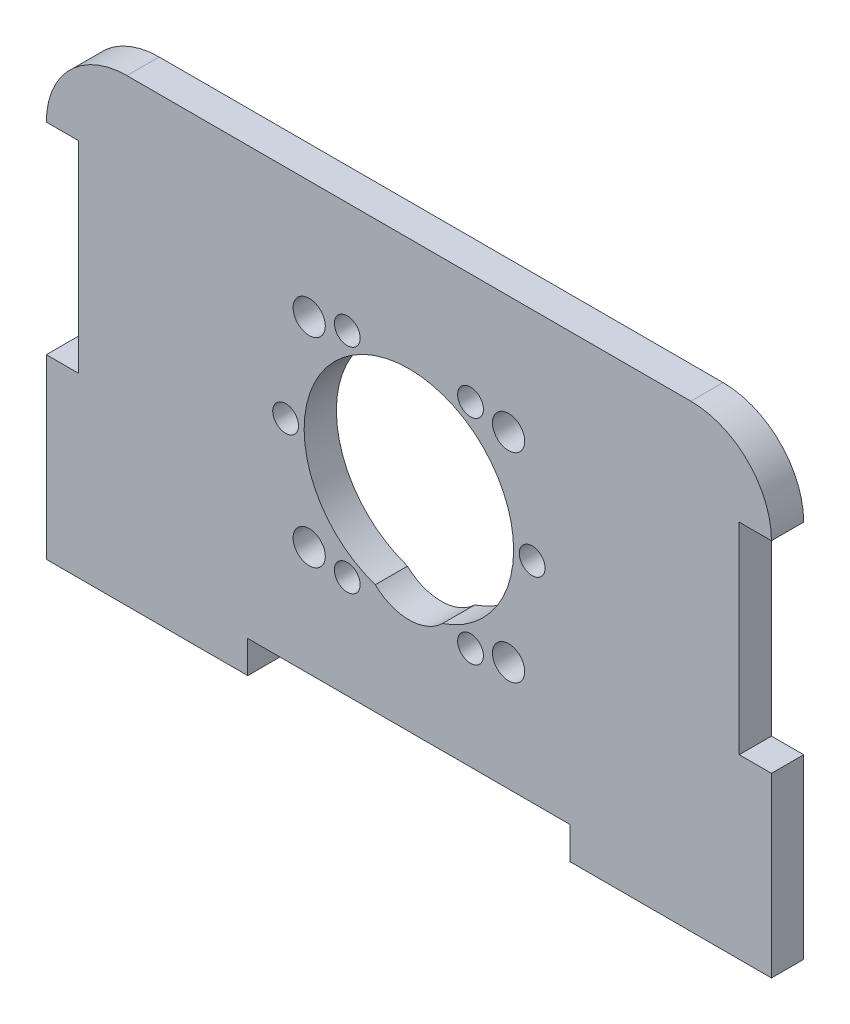
ISO-10303-21;
HEADER;
FILE_DESCRIPTION(('STEP AP214'),'2;1');
FILE_NAME('part.step','',(''),(''),'','','');
FILE_SCHEMA(('AUTOMOTIVE_DESIGN { 1 0 10303 214 1 1 1 1 }'));
ENDSEC;
DATA;
#1=APPLICATION_CONTEXT('core data for automotive mechanical design processes');
#2=APPLICATION_PROTOCOL_DEFINITION('international standard','automotive_design',2000,#1);
#3=PRODUCT_CONTEXT('',#1,'mechanical');
#4=PRODUCT('Part','Part','',(#3));
#5=PRODUCT_RELATED_PRODUCT_CATEGORY('part','',(#4));
#6=PRODUCT_DEFINITION_FORMATION('','',#4);
#7=PRODUCT_DEFINITION_CONTEXT('part definition',#1,'design');
#8=PRODUCT_DEFINITION('design','',#6,#7);
#9=PRODUCT_DEFINITION_SHAPE('','',#8);
#10=(LENGTH_UNIT() NAMED_UNIT(*) SI_UNIT(.MILLI.,.METRE.));
#11=(NAMED_UNIT(*) PLANE_ANGLE_UNIT() SI_UNIT($,.RADIAN.));
#12=(NAMED_UNIT(*) SI_UNIT($,.STERADIAN.) SOLID_ANGLE_UNIT());
#13=UNCERTAINTY_MEASURE_WITH_UNIT(LENGTH_MEASURE(1.E-05),#10,'distance_accuracy_value','');
#14=(GEOMETRIC_REPRESENTATION_CONTEXT(3) GLOBAL_UNCERTAINTY_ASSIGNED_CONTEXT((#13)) GLOBAL_UNIT_ASSIGNED_CONTEXT((#10,
#11,#12)) REPRESENTATION_CONTEXT('',''));
#15=CARTESIAN_POINT('',(0.,0.,0.));
#16=DIRECTION('',(0.,0.,1.));
#17=DIRECTION('',(1.,0.,0.));
#18=AXIS2_PLACEMENT_3D('',#15,#16,#17);
#19=CARTESIAN_POINT('',(25.,50.,2.));
#20=DIRECTION('',(0.,0.,-1.));
#21=DIRECTION('',(-1.,0.,0.));
#22=AXIS2_PLACEMENT_3D('',#19,#20,#21);
#23=PLANE('',#22);
#24=CARTESIAN_POINT('',(-7.65000000000015,36.2501886779018,2.));
#25=DIRECTION('',(0.,0.,1.));
#26=DIRECTION('',(0.50000000000001,-0.866025403784433,0.));
#27=AXIS2_PLACEMENT_3D('',#24,#25,#26);
#28=CIRCLE('',#27,1.6);
#29=CARTESIAN_POINT('',(-6.85000000000014,34.8645480318467,2.));
#30=VERTEX_POINT('',#29);
#31=EDGE_CURVE('E251',#30,#30,#28,.T.);
#32=ORIENTED_EDGE('',*,*,#31,.F.);
#33=EDGE_LOOP('',(#32));
#34=FACE_BOUND('',#33,.T.);
#35=CARTESIAN_POINT('',(7.64999999999988,36.250188677902,2.));
#36=DIRECTION('',(0.,0.,1.));
#37=DIRECTION('',(-0.499999999999992,-0.866025403784443,0.));
#38=AXIS2_PLACEMENT_3D('',#35,#36,#37);
#39=CIRCLE('',#38,1.6);
#40=CARTESIAN_POINT('',(6.84999999999989,34.8645480318469,2.));
#41=VERTEX_POINT('',#40);
#42=EDGE_CURVE('E258',#41,#41,#39,.T.);
#43=ORIENTED_EDGE('',*,*,#42,.F.);
#44=EDGE_LOOP('',(#43));
#45=FACE_BOUND('',#44,.T.);
#46=CARTESIAN_POINT('',(15.3,23.,2.));
#47=DIRECTION('',(0.,0.,1.));
#48=DIRECTION('',(-1.,0.,0.));
#49=AXIS2_PLACEMENT_3D('',#46,#47,#48);
#50=CIRCLE('',#49,1.6);
#51=CARTESIAN_POINT('',(13.7,23.,2.));
#52=VERTEX_POINT('',#51);
#53=EDGE_CURVE('E255',#52,#52,#50,.T.);
#54=ORIENTED_EDGE('',*,*,#53,.F.);
#55=EDGE_LOOP('',(#54));
#56=FACE_BOUND('',#55,.T.);
#57=CARTESIAN_POINT('',(7.65000000000006,9.74981132209812,2.));
#58=DIRECTION('',(0.,0.,1.));
#59=DIRECTION('',(-0.500000000000004,0.866025403784436,0.));
#60=AXIS2_PLACEMENT_3D('',#57,#58,#59);
#61=CIRCLE('',#60,1.6);
#62=CARTESIAN_POINT('',(6.85000000000006,11.1354519681532,2.));
#63=VERTEX_POINT('',#62);
#64=EDGE_CURVE('E252',#63,#63,#61,.T.);
#65=ORIENTED_EDGE('',*,*,#64,.F.);
#66=EDGE_LOOP('',(#65));
#67=FACE_BOUND('',#66,.T.);
#68=CARTESIAN_POINT('',(-7.64999999999997,9.74981132209807,2.));
#69=DIRECTION('',(0.,0.,1.));
#70=DIRECTION('',(0.499999999999998,0.86602540378444,0.));
#71=AXIS2_PLACEMENT_3D('',#68,#69,#70);
#72=CIRCLE('',#71,1.6);
#73=CARTESIAN_POINT('',(-6.84999999999997,11.1354519681532,2.));
#74=VERTEX_POINT('',#73);
#75=EDGE_CURVE('E197',#74,#74,#72,.T.);
#76=ORIENTED_EDGE('',*,*,#75,.F.);
#77=EDGE_LOOP('',(#76));
#78=FACE_BOUND('',#77,.T.);
#79=CARTESIAN_POINT('',(-15.3,23.,2.));
#80=DIRECTION('',(0.,0.,1.));
#81=DIRECTION('',(1.,0.,0.));
#82=AXIS2_PLACEMENT_3D('',#79,#80,#81);
#83=CIRCLE('',#82,1.6);
#84=CARTESIAN_POINT('',(-13.7,23.,2.));
#85=VERTEX_POINT('',#84);
#86=EDGE_CURVE('E192',#85,#85,#83,.T.);
#87=ORIENTED_EDGE('',*,*,#86,.F.);
#88=EDGE_LOOP('',(#87));
#89=FACE_BOUND('',#88,.T.);
#90=CARTESIAN_POINT('',(-12.3743686707645,10.6256313292353,2.));
#91=DIRECTION('',(0.,0.,1.));
#92=DIRECTION('',(1.,0.,0.));
#93=AXIS2_PLACEMENT_3D('',#90,#91,#92);
#94=CIRCLE('',#93,2.);
#95=CARTESIAN_POINT('',(-10.3743686707645,10.6256313292353,2.));
#96=VERTEX_POINT('',#95);
#97=EDGE_CURVE('E319',#96,#96,#94,.T.);
#98=ORIENTED_EDGE('',*,*,#97,.F.);
#99=EDGE_LOOP('',(#98));
#100=FACE_BOUND('',#99,.T.);
#101=CARTESIAN_POINT('',(12.3743686707646,10.6256313292354,2.));
#102=DIRECTION('',(0.,0.,1.));
#103=DIRECTION('',(1.,0.,0.));
#104=AXIS2_PLACEMENT_3D('',#101,#102,#103);
#105=CIRCLE('',#104,2.);
#106=CARTESIAN_POINT('',(14.3743686707646,10.6256313292354,2.));
#107=VERTEX_POINT('',#106);
#108=EDGE_CURVE('E324',#107,#107,#105,.T.);
#109=ORIENTED_EDGE('',*,*,#108,.F.);
#110=EDGE_LOOP('',(#109));
#111=FACE_BOUND('',#110,.T.);
#112=CARTESIAN_POINT('',(12.3743686707646,35.3743686707646,2.));
#113=DIRECTION('',(0.,0.,1.));
#114=DIRECTION('',(1.,0.,0.));
#115=AXIS2_PLACEMENT_3D('',#112,#113,#114);
#116=CIRCLE('',#115,2.);
#117=CARTESIAN_POINT('',(14.3743686707646,35.3743686707646,2.));
#118=VERTEX_POINT('',#117);
#119=EDGE_CURVE('E320',#118,#118,#116,.T.);
#120=ORIENTED_EDGE('',*,*,#119,.F.);
#121=EDGE_LOOP('',(#120));
#122=FACE_BOUND('',#121,.T.);
#123=CARTESIAN_POINT('',(-12.3743686707646,35.3743686707646,2.));
#124=DIRECTION('',(0.,0.,1.));
#125=DIRECTION('',(1.,0.,0.));
#126=AXIS2_PLACEMENT_3D('',#123,#124,#125);
#127=CIRCLE('',#126,2.);
#128=CARTESIAN_POINT('',(-10.3743686707646,35.3743686707646,2.));
#129=VERTEX_POINT('',#128);
#130=EDGE_CURVE('E323',#129,#129,#127,.T.);
#131=ORIENTED_EDGE('',*,*,#130,.F.);
#132=EDGE_LOOP('',(#131));
#133=FACE_BOUND('',#132,.T.);
#134=CARTESIAN_POINT('',(0.,23.,2.));
#135=DIRECTION('',(0.,0.,1.));
#136=DIRECTION('',(1.,0.,0.));
#137=AXIS2_PLACEMENT_3D('',#134,#135,#136);
#138=CIRCLE('',#137,13.);
#139=CARTESIAN_POINT('',(4.17161164899131,10.6875,2.));
#140=VERTEX_POINT('',#139);
#141=CARTESIAN_POINT('',(-4.17161164899131,10.6875,2.));
#142=VERTEX_POINT('',#141);
#143=EDGE_CURVE('E332',#140,#142,#138,.T.);
#144=ORIENTED_EDGE('',*,*,#143,.F.);
#145=CARTESIAN_POINT('',(0.,15.,2.));
#146=DIRECTION('',(0.,0.,1.));
#147=DIRECTION('',(1.,0.,0.));
#148=AXIS2_PLACEMENT_3D('',#145,#146,#147);
#149=CIRCLE('',#148,6.);
#150=EDGE_CURVE('E248',#142,#140,#149,.T.);
#151=ORIENTED_EDGE('',*,*,#150,.F.);
#152=EDGE_LOOP('',(#144,#151));
#153=FACE_BOUND('',#152,.T.);
#154=DIRECTION('',(0.,1.,0.));
#155=VECTOR('',#154,1.);
#156=CARTESIAN_POINT('',(45.,50.,2.));
#157=LINE('',#156,#155);
#158=CARTESIAN_POINT('',(45.,-7.,2.));
#159=VERTEX_POINT('',#158);
#160=CARTESIAN_POINT('',(45.,15.,2.));
#161=VERTEX_POINT('',#160);
#162=EDGE_CURVE('E310',#159,#161,#157,.T.);
#163=ORIENTED_EDGE('',*,*,#162,.T.);
#164=DIRECTION('',(1.,0.,0.));
#165=VECTOR('',#164,1.);
#166=CARTESIAN_POINT('',(45.,15.,2.));
#167=LINE('',#166,#165);
#168=CARTESIAN_POINT('',(41.,15.,2.));
#169=VERTEX_POINT('',#168);
#170=EDGE_CURVE('E376',#169,#161,#167,.T.);
#171=ORIENTED_EDGE('',*,*,#170,.F.);
#172=DIRECTION('',(0.,-1.,0.));
#173=VECTOR('',#172,1.);
#174=CARTESIAN_POINT('',(41.,40.,2.));
#175=LINE('',#174,#173);
#176=CARTESIAN_POINT('',(41.,40.,2.));
#177=VERTEX_POINT('',#176);
#178=EDGE_CURVE('E175',#177,#169,#175,.T.);
#179=ORIENTED_EDGE('',*,*,#178,.F.);
#180=DIRECTION('',(-1.,0.,0.));
#181=VECTOR('',#180,1.);
#182=CARTESIAN_POINT('',(45.,40.,2.));
#183=LINE('',#182,#181);
#184=CARTESIAN_POINT('',(45.,40.,2.));
#185=VERTEX_POINT('',#184);
#186=EDGE_CURVE('E163',#185,#177,#183,.T.);
#187=ORIENTED_EDGE('',*,*,#186,.F.);
#188=CARTESIAN_POINT('',(35.,40.,2.));
#189=DIRECTION('',(0.,0.,-1.));
#190=DIRECTION('',(-1.,0.,0.));
#191=AXIS2_PLACEMENT_3D('',#188,#189,#190);
#192=CIRCLE('',#191,10.);
#193=CARTESIAN_POINT('',(35.,50.,2.));
#194=VERTEX_POINT('',#193);
#195=EDGE_CURVE('E56',#185,#194,#192,.F.);
#196=ORIENTED_EDGE('',*,*,#195,.T.);
#197=DIRECTION('',(1.,0.,0.));
#198=VECTOR('',#197,1.);
#199=CARTESIAN_POINT('',(25.,50.,2.));
#200=LINE('',#199,#198);
#201=CARTESIAN_POINT('',(-35.,50.,2.));
#202=VERTEX_POINT('',#201);
#203=EDGE_CURVE('E337',#202,#194,#200,.T.);
#204=ORIENTED_EDGE('',*,*,#203,.F.);
#205=CARTESIAN_POINT('',(-35.,40.,2.));
#206=DIRECTION('',(0.,0.,-1.));
#207=DIRECTION('',(-1.,0.,0.));
#208=AXIS2_PLACEMENT_3D('',#205,#206,#207);
#209=CIRCLE('',#208,10.);
#210=CARTESIAN_POINT('',(-45.,40.,2.));
#211=VERTEX_POINT('',#210);
#212=EDGE_CURVE('E170',#202,#211,#209,.F.);
#213=ORIENTED_EDGE('',*,*,#212,.T.);
#214=DIRECTION('',(-1.,0.,0.));
#215=VECTOR('',#214,1.);
#216=CARTESIAN_POINT('',(-45.,40.,2.));
#217=LINE('',#216,#215);
#218=CARTESIAN_POINT('',(-41.,40.,2.));
#219=VERTEX_POINT('',#218);
#220=EDGE_CURVE('E368',#219,#211,#217,.T.);
#221=ORIENTED_EDGE('',*,*,#220,.F.);
#222=DIRECTION('',(0.,1.,0.));
#223=VECTOR('',#222,1.);
#224=CARTESIAN_POINT('',(-41.,40.,2.));
#225=LINE('',#224,#223);
#226=CARTESIAN_POINT('',(-41.,15.,2.));
#227=VERTEX_POINT('',#226);
#228=EDGE_CURVE('E237',#227,#219,#225,.T.);
#229=ORIENTED_EDGE('',*,*,#228,.F.);
#230=DIRECTION('',(1.,0.,0.));
#231=VECTOR('',#230,1.);
#232=CARTESIAN_POINT('',(-45.,15.,2.));
#233=LINE('',#232,#231);
#234=CARTESIAN_POINT('',(-45.,15.,2.));
#235=VERTEX_POINT('',#234);
#236=EDGE_CURVE('E232',#235,#227,#233,.T.);
#237=ORIENTED_EDGE('',*,*,#236,.F.);
#238=DIRECTION('',(0.,1.,0.));
#239=VECTOR('',#238,1.);
#240=CARTESIAN_POINT('',(-45.,50.,2.));
#241=LINE('',#240,#239);
#242=CARTESIAN_POINT('',(-45.,-7.,2.));
#243=VERTEX_POINT('',#242);
#244=EDGE_CURVE('E314',#243,#235,#241,.T.);
#245=ORIENTED_EDGE('',*,*,#244,.F.);
#246=DIRECTION('',(1.,0.,0.));
#247=VECTOR('',#246,1.);
#248=CARTESIAN_POINT('',(-45.,-7.,2.));
#249=LINE('',#248,#247);
#250=CARTESIAN_POINT('',(-20.,-7.,2.));
#251=VERTEX_POINT('',#250);
#252=EDGE_CURVE('E282',#243,#251,#249,.T.);
#253=ORIENTED_EDGE('',*,*,#252,.T.);
#254=DIRECTION('',(0.,1.,0.));
#255=VECTOR('',#254,1.);
#256=CARTESIAN_POINT('',(-20.,-3.,2.));
#257=LINE('',#256,#255);
#258=CARTESIAN_POINT('',(-20.,-3.,2.));
#259=VERTEX_POINT('',#258);
#260=EDGE_CURVE('E291',#251,#259,#257,.T.);
#261=ORIENTED_EDGE('',*,*,#260,.T.);
#262=DIRECTION('',(-1.,0.,0.));
#263=VECTOR('',#262,1.);
#264=CARTESIAN_POINT('',(-45.,-3.,2.00000000000001));
#265=LINE('',#264,#263);
#266=CARTESIAN_POINT('',(20.,-3.,2.));
#267=VERTEX_POINT('',#266);
#268=EDGE_CURVE('E308',#267,#259,#265,.T.);
#269=ORIENTED_EDGE('',*,*,#268,.F.);
#270=DIRECTION('',(0.,-1.,0.));
#271=VECTOR('',#270,1.);
#272=CARTESIAN_POINT('',(20.,-3.,2.));
#273=LINE('',#272,#271);
#274=CARTESIAN_POINT('',(20.,-7.,2.));
#275=VERTEX_POINT('',#274);
#276=EDGE_CURVE('E191',#267,#275,#273,.T.);
#277=ORIENTED_EDGE('',*,*,#276,.T.);
#278=DIRECTION('',(1.,0.,0.));
#279=VECTOR('',#278,1.);
#280=CARTESIAN_POINT('',(45.,-7.,2.));
#281=LINE('',#280,#279);
#282=EDGE_CURVE('E271',#275,#159,#281,.T.);
#283=ORIENTED_EDGE('',*,*,#282,.T.);
#284=EDGE_LOOP('',(#163,#171,#179,#187,#196,#204,#213,#221,#229,#237,#245,#253,#261,#269,#277,#283));
#285=FACE_BOUND('',#284,.T.);
#286=ADVANCED_FACE('F33',(#34,#45,#56,#67,#78,#89,#100,#111,#122,#133,#153,#285),#23,.F.);
#287=CARTESIAN_POINT('',(25.,50.,-2.));
#288=DIRECTION('',(0.,0.,1.));
#289=DIRECTION('',(1.,0.,0.));
#290=AXIS2_PLACEMENT_3D('',#287,#288,#289);
#291=PLANE('',#290);
#292=CARTESIAN_POINT('',(-7.65000000000015,36.2501886779018,-2.));
#293=DIRECTION('',(0.,0.,1.));
#294=DIRECTION('',(1.,0.,0.));
#295=AXIS2_PLACEMENT_3D('',#292,#293,#294);
#296=CIRCLE('',#295,1.6);
#297=CARTESIAN_POINT('',(-6.05000000000015,36.2501886779018,-2.));
#298=VERTEX_POINT('',#297);
#299=EDGE_CURVE('E206',#298,#298,#296,.T.);
#300=ORIENTED_EDGE('',*,*,#299,.T.);
#301=EDGE_LOOP('',(#300));
#302=FACE_BOUND('',#301,.T.);
#303=CARTESIAN_POINT('',(7.64999999999988,36.250188677902,-2.));
#304=DIRECTION('',(0.,0.,1.));
#305=DIRECTION('',(1.,0.,0.));
#306=AXIS2_PLACEMENT_3D('',#303,#304,#305);
#307=CIRCLE('',#306,1.6);
#308=CARTESIAN_POINT('',(9.24999999999988,36.250188677902,-2.));
#309=VERTEX_POINT('',#308);
#310=EDGE_CURVE('E203',#309,#309,#307,.T.);
#311=ORIENTED_EDGE('',*,*,#310,.T.);
#312=EDGE_LOOP('',(#311));
#313=FACE_BOUND('',#312,.T.);
#314=CARTESIAN_POINT('',(15.3,23.,-2.));
#315=DIRECTION('',(0.,0.,1.));
#316=DIRECTION('',(1.,0.,0.));
#317=AXIS2_PLACEMENT_3D('',#314,#315,#316);
#318=CIRCLE('',#317,1.6);
#319=CARTESIAN_POINT('',(16.9,23.,-2.));
#320=VERTEX_POINT('',#319);
#321=EDGE_CURVE('E200',#320,#320,#318,.T.);
#322=ORIENTED_EDGE('',*,*,#321,.T.);
#323=EDGE_LOOP('',(#322));
#324=FACE_BOUND('',#323,.T.);
#325=CARTESIAN_POINT('',(7.65000000000006,9.74981132209812,-2.));
#326=DIRECTION('',(0.,0.,1.));
#327=DIRECTION('',(1.,0.,0.));
#328=AXIS2_PLACEMENT_3D('',#325,#326,#327);
#329=CIRCLE('',#328,1.6);
#330=CARTESIAN_POINT('',(9.25000000000007,9.74981132209812,-2.));
#331=VERTEX_POINT('',#330);
#332=EDGE_CURVE('E196',#331,#331,#329,.T.);
#333=ORIENTED_EDGE('',*,*,#332,.T.);
#334=EDGE_LOOP('',(#333));
#335=FACE_BOUND('',#334,.T.);
#336=CARTESIAN_POINT('',(-7.64999999999997,9.74981132209807,-2.));
#337=DIRECTION('',(0.,0.,1.));
#338=DIRECTION('',(1.,0.,0.));
#339=AXIS2_PLACEMENT_3D('',#336,#337,#338);
#340=CIRCLE('',#339,1.6);
#341=CARTESIAN_POINT('',(-6.04999999999997,9.74981132209807,-2.));
#342=VERTEX_POINT('',#341);
#343=EDGE_CURVE('E193',#342,#342,#340,.T.);
#344=ORIENTED_EDGE('',*,*,#343,.T.);
#345=EDGE_LOOP('',(#344));
#346=FACE_BOUND('',#345,.T.);
#347=CARTESIAN_POINT('',(-15.3,23.,-2.));
#348=DIRECTION('',(0.,0.,1.));
#349=DIRECTION('',(1.,0.,0.));
#350=AXIS2_PLACEMENT_3D('',#347,#348,#349);
#351=CIRCLE('',#350,1.6);
#352=CARTESIAN_POINT('',(-13.7,23.,-2.));
#353=VERTEX_POINT('',#352);
#354=EDGE_CURVE('E188',#353,#353,#351,.T.);
#355=ORIENTED_EDGE('',*,*,#354,.T.);
#356=EDGE_LOOP('',(#355));
#357=FACE_BOUND('',#356,.T.);
#358=CARTESIAN_POINT('',(-12.3743686707645,10.6256313292353,-1.99999999999999));
#359=DIRECTION('',(0.,0.,1.));
#360=DIRECTION('',(1.,0.,0.));
#361=AXIS2_PLACEMENT_3D('',#358,#359,#360);
#362=CIRCLE('',#361,2.);
#363=CARTESIAN_POINT('',(-10.3743686707645,10.6256313292353,-2.));
#364=VERTEX_POINT('',#363);
#365=EDGE_CURVE('E336',#364,#364,#362,.T.);
#366=ORIENTED_EDGE('',*,*,#365,.T.);
#367=EDGE_LOOP('',(#366));
#368=FACE_BOUND('',#367,.T.);
#369=CARTESIAN_POINT('',(12.3743686707646,10.6256313292354,-2.));
#370=DIRECTION('',(0.,0.,1.));
#371=DIRECTION('',(1.,0.,0.));
#372=AXIS2_PLACEMENT_3D('',#369,#370,#371);
#373=CIRCLE('',#372,2.);
#374=CARTESIAN_POINT('',(14.3743686707646,10.6256313292354,-2.));
#375=VERTEX_POINT('',#374);
#376=EDGE_CURVE('E350',#375,#375,#373,.T.);
#377=ORIENTED_EDGE('',*,*,#376,.T.);
#378=EDGE_LOOP('',(#377));
#379=FACE_BOUND('',#378,.T.);
#380=CARTESIAN_POINT('',(12.3743686707646,35.3743686707646,-2.));
#381=DIRECTION('',(0.,0.,1.));
#382=DIRECTION('',(1.,0.,0.));
#383=AXIS2_PLACEMENT_3D('',#380,#381,#382);
#384=CIRCLE('',#383,2.);
#385=CARTESIAN_POINT('',(14.3743686707646,35.3743686707646,-2.));
#386=VERTEX_POINT('',#385);
#387=EDGE_CURVE('E347',#386,#386,#384,.T.);
#388=ORIENTED_EDGE('',*,*,#387,.T.);
#389=EDGE_LOOP('',(#388));
#390=FACE_BOUND('',#389,.T.);
#391=CARTESIAN_POINT('',(-12.3743686707646,35.3743686707646,-1.99999999999999));
#392=DIRECTION('',(0.,0.,1.));
#393=DIRECTION('',(1.,0.,0.));
#394=AXIS2_PLACEMENT_3D('',#391,#392,#393);
#395=CIRCLE('',#394,2.);
#396=CARTESIAN_POINT('',(-10.3743686707646,35.3743686707646,-2.));
#397=VERTEX_POINT('',#396);
#398=EDGE_CURVE('E331',#397,#397,#395,.T.);
#399=ORIENTED_EDGE('',*,*,#398,.T.);
#400=EDGE_LOOP('',(#399));
#401=FACE_BOUND('',#400,.T.);
#402=CARTESIAN_POINT('',(0.,23.,-2.));
#403=DIRECTION('',(0.,0.,1.));
#404=DIRECTION('',(1.,0.,0.));
#405=AXIS2_PLACEMENT_3D('',#402,#403,#404);
#406=CIRCLE('',#405,13.);
#407=CARTESIAN_POINT('',(4.17161164899131,10.6875,-2.));
#408=VERTEX_POINT('',#407);
#409=CARTESIAN_POINT('',(-4.17161164899131,10.6875,-2.));
#410=VERTEX_POINT('',#409);
#411=EDGE_CURVE('E335',#408,#410,#406,.T.);
#412=ORIENTED_EDGE('',*,*,#411,.T.);
#413=CARTESIAN_POINT('',(0.,15.,-2.));
#414=DIRECTION('',(0.,0.,1.));
#415=DIRECTION('',(1.,0.,0.));
#416=AXIS2_PLACEMENT_3D('',#413,#414,#415);
#417=CIRCLE('',#416,6.);
#418=EDGE_CURVE('E48',#410,#408,#417,.T.);
#419=ORIENTED_EDGE('',*,*,#418,.T.);
#420=EDGE_LOOP('',(#412,#419));
#421=FACE_BOUND('',#420,.T.);
#422=DIRECTION('',(0.,-1.,0.));
#423=VECTOR('',#422,1.);
#424=CARTESIAN_POINT('',(41.,50.,-2.));
#425=LINE('',#424,#423);
#426=CARTESIAN_POINT('',(41.,40.,-2.00000000000001));
#427=VERTEX_POINT('',#426);
#428=CARTESIAN_POINT('',(41.,15.,-2.00000000000001));
#429=VERTEX_POINT('',#428);
#430=EDGE_CURVE('E11',#427,#429,#425,.T.);
#431=ORIENTED_EDGE('',*,*,#430,.T.);
#432=DIRECTION('',(1.,0.,0.));
#433=VECTOR('',#432,1.);
#434=CARTESIAN_POINT('',(25.,15.,-2.));
#435=LINE('',#434,#433);
#436=CARTESIAN_POINT('',(45.,15.,-2.));
#437=VERTEX_POINT('',#436);
#438=EDGE_CURVE('E244',#429,#437,#435,.T.);
#439=ORIENTED_EDGE('',*,*,#438,.T.);
#440=DIRECTION('',(0.,-1.,0.));
#441=VECTOR('',#440,1.);
#442=CARTESIAN_POINT('',(45.,50.,-2.));
#443=LINE('',#442,#441);
#444=CARTESIAN_POINT('',(45.,-7.,-2.));
#445=VERTEX_POINT('',#444);
#446=EDGE_CURVE('E312',#437,#445,#443,.T.);
#447=ORIENTED_EDGE('',*,*,#446,.T.);
#448=DIRECTION('',(1.,0.,0.));
#449=VECTOR('',#448,1.);
#450=CARTESIAN_POINT('',(45.,-7.,-2.));
#451=LINE('',#450,#449);
#452=CARTESIAN_POINT('',(20.,-7.,-2.));
#453=VERTEX_POINT('',#452);
#454=EDGE_CURVE('E270',#453,#445,#451,.T.);
#455=ORIENTED_EDGE('',*,*,#454,.F.);
#456=DIRECTION('',(0.,-1.,0.));
#457=VECTOR('',#456,1.);
#458=CARTESIAN_POINT('',(20.,-3.,-2.));
#459=LINE('',#458,#457);
#460=CARTESIAN_POINT('',(20.,-3.,-2.));
#461=VERTEX_POINT('',#460);
#462=EDGE_CURVE('E267',#461,#453,#459,.T.);
#463=ORIENTED_EDGE('',*,*,#462,.F.);
#464=DIRECTION('',(1.,0.,0.));
#465=VECTOR('',#464,1.);
#466=CARTESIAN_POINT('',(-45.,-3.,-2.));
#467=LINE('',#466,#465);
#468=CARTESIAN_POINT('',(-20.,-3.,-2.));
#469=VERTEX_POINT('',#468);
#470=EDGE_CURVE('E302',#469,#461,#467,.T.);
#471=ORIENTED_EDGE('',*,*,#470,.F.);
#472=DIRECTION('',(0.,1.,0.));
#473=VECTOR('',#472,1.);
#474=CARTESIAN_POINT('',(-20.,-3.,-2.));
#475=LINE('',#474,#473);
#476=CARTESIAN_POINT('',(-20.,-7.,-2.));
#477=VERTEX_POINT('',#476);
#478=EDGE_CURVE('E290',#477,#469,#475,.T.);
#479=ORIENTED_EDGE('',*,*,#478,.F.);
#480=DIRECTION('',(1.,0.,0.));
#481=VECTOR('',#480,1.);
#482=CARTESIAN_POINT('',(-45.,-7.,-2.));
#483=LINE('',#482,#481);
#484=CARTESIAN_POINT('',(-45.,-7.,-2.));
#485=VERTEX_POINT('',#484);
#486=EDGE_CURVE('E287',#485,#477,#483,.T.);
#487=ORIENTED_EDGE('',*,*,#486,.F.);
#488=DIRECTION('',(0.,-1.,0.));
#489=VECTOR('',#488,1.);
#490=CARTESIAN_POINT('',(-45.,50.,-2.));
#491=LINE('',#490,#489);
#492=CARTESIAN_POINT('',(-45.,15.,-2.));
#493=VERTEX_POINT('',#492);
#494=EDGE_CURVE('E317',#493,#485,#491,.T.);
#495=ORIENTED_EDGE('',*,*,#494,.F.);
#496=DIRECTION('',(1.,0.,0.));
#497=VECTOR('',#496,1.);
#498=CARTESIAN_POINT('',(25.0000000000001,15.0000000000002,-2.));
#499=LINE('',#498,#497);
#500=CARTESIAN_POINT('',(-41.,15.,-1.99999999999999));
#501=VERTEX_POINT('',#500);
#502=EDGE_CURVE('E220',#493,#501,#499,.T.);
#503=ORIENTED_EDGE('',*,*,#502,.T.);
#504=DIRECTION('',(0.,1.,0.));
#505=VECTOR('',#504,1.);
#506=CARTESIAN_POINT('',(-41.,50.,-2.));
#507=LINE('',#506,#505);
#508=CARTESIAN_POINT('',(-41.,40.,-1.99999999999999));
#509=VERTEX_POINT('',#508);
#510=EDGE_CURVE('E41',#501,#509,#507,.T.);
#511=ORIENTED_EDGE('',*,*,#510,.T.);
#512=DIRECTION('',(-1.,0.,0.));
#513=VECTOR('',#512,1.);
#514=CARTESIAN_POINT('',(25.0000000000001,40.0000000000005,-2.));
#515=LINE('',#514,#513);
#516=CARTESIAN_POINT('',(-45.,40.,-2.));
#517=VERTEX_POINT('',#516);
#518=EDGE_CURVE('E217',#509,#517,#515,.T.);
#519=ORIENTED_EDGE('',*,*,#518,.T.);
#520=CARTESIAN_POINT('',(-35.,40.,-2.));
#521=DIRECTION('',(0.,0.,1.));
#522=DIRECTION('',(1.,0.,0.));
#523=AXIS2_PLACEMENT_3D('',#520,#521,#522);
#524=CIRCLE('',#523,10.);
#525=CARTESIAN_POINT('',(-35.,50.,-2.));
#526=VERTEX_POINT('',#525);
#527=EDGE_CURVE('E358',#517,#526,#524,.F.);
#528=ORIENTED_EDGE('',*,*,#527,.T.);
#529=DIRECTION('',(-1.,0.,0.));
#530=VECTOR('',#529,1.);
#531=CARTESIAN_POINT('',(25.,50.,-2.));
#532=LINE('',#531,#530);
#533=CARTESIAN_POINT('',(35.,50.,-2.));
#534=VERTEX_POINT('',#533);
#535=EDGE_CURVE('E339',#534,#526,#532,.T.);
#536=ORIENTED_EDGE('',*,*,#535,.F.);
#537=CARTESIAN_POINT('',(35.,40.,-2.));
#538=DIRECTION('',(0.,0.,1.));
#539=DIRECTION('',(1.,0.,0.));
#540=AXIS2_PLACEMENT_3D('',#537,#538,#539);
#541=CIRCLE('',#540,10.);
#542=CARTESIAN_POINT('',(45.,40.,-2.));
#543=VERTEX_POINT('',#542);
#544=EDGE_CURVE('E356',#534,#543,#541,.F.);
#545=ORIENTED_EDGE('',*,*,#544,.T.);
#546=DIRECTION('',(-1.,0.,0.));
#547=VECTOR('',#546,1.);
#548=CARTESIAN_POINT('',(25.,40.,-2.));
#549=LINE('',#548,#547);
#550=EDGE_CURVE('E166',#543,#427,#549,.T.);
#551=ORIENTED_EDGE('',*,*,#550,.T.);
#552=EDGE_LOOP('',(#431,#439,#447,#455,#463,#471,#479,#487,#495,#503,#511,#519,#528,#536,#545,#551));
#553=FACE_BOUND('',#552,.T.);
#554=ADVANCED_FACE('F216',(#302,#313,#324,#335,#346,#357,#368,#379,#390,#401,#421,#553),#291,.F.);
#555=CARTESIAN_POINT('',(0.,50.,0.));
#556=DIRECTION('',(0.,1.,0.));
#557=DIRECTION('',(0.,0.,1.));
#558=AXIS2_PLACEMENT_3D('',#555,#556,#557);
#559=PLANE('',#558);
#560=ORIENTED_EDGE('',*,*,#535,.T.);
#561=DIRECTION('',(0.,0.,-1.));
#562=VECTOR('',#561,1.);
#563=CARTESIAN_POINT('',(-35.,50.,2.));
#564=LINE('',#563,#562);
#565=EDGE_CURVE('E181',#526,#202,#564,.F.);
#566=ORIENTED_EDGE('',*,*,#565,.T.);
#567=ORIENTED_EDGE('',*,*,#203,.T.);
#568=DIRECTION('',(0.,0.,-1.));
#569=VECTOR('',#568,1.);
#570=CARTESIAN_POINT('',(35.,50.,-2.));
#571=LINE('',#570,#569);
#572=EDGE_CURVE('E180',#194,#534,#571,.T.);
#573=ORIENTED_EDGE('',*,*,#572,.T.);
#574=EDGE_LOOP('',(#560,#566,#567,#573));
#575=FACE_BOUND('',#574,.T.);
#576=ADVANCED_FACE('F361',(#575),#559,.T.);
#577=CARTESIAN_POINT('',(0.,23.,-48.));
#578=DIRECTION('',(0.,0.,1.));
#579=DIRECTION('',(1.,0.,0.));
#580=AXIS2_PLACEMENT_3D('',#577,#578,#579);
#581=CYLINDRICAL_SURFACE('',#580,13.);
#582=ORIENTED_EDGE('',*,*,#411,.F.);
#583=DIRECTION('',(0.,0.,1.));
#584=VECTOR('',#583,1.);
#585=CARTESIAN_POINT('',(4.17161164899131,10.6875,-8.));
#586=LINE('',#585,#584);
#587=EDGE_CURVE('E210',#408,#140,#586,.T.);
#588=ORIENTED_EDGE('',*,*,#587,.T.);
#589=ORIENTED_EDGE('',*,*,#143,.T.);
#590=DIRECTION('',(0.,0.,1.));
#591=VECTOR('',#590,1.);
#592=CARTESIAN_POINT('',(-4.17161164899131,10.6875,-8.));
#593=LINE('',#592,#591);
#594=EDGE_CURVE('E169',#142,#410,#593,.F.);
#595=ORIENTED_EDGE('',*,*,#594,.T.);
#596=EDGE_LOOP('',(#582,#588,#589,#595));
#597=FACE_BOUND('',#596,.T.);
#598=ADVANCED_FACE('F670',(#597),#581,.F.);
#599=CARTESIAN_POINT('',(-12.3743686707646,35.3743686707646,-48.));
#600=DIRECTION('',(0.,0.,1.));
#601=DIRECTION('',(1.,0.,0.));
#602=AXIS2_PLACEMENT_3D('',#599,#600,#601);
#603=CYLINDRICAL_SURFACE('',#602,2.);
#604=ORIENTED_EDGE('',*,*,#130,.T.);
#605=EDGE_LOOP('',(#604));
#606=FACE_BOUND('',#605,.T.);
#607=ORIENTED_EDGE('',*,*,#398,.F.);
#608=EDGE_LOOP('',(#607));
#609=FACE_BOUND('',#608,.T.);
#610=ADVANCED_FACE('F661',(#606,#609),#603,.F.);
#611=CARTESIAN_POINT('',(12.3743686707646,35.3743686707646,-48.));
#612=DIRECTION('',(0.,0.,1.));
#613=DIRECTION('',(1.,0.,0.));
#614=AXIS2_PLACEMENT_3D('',#611,#612,#613);
#615=CYLINDRICAL_SURFACE('',#614,2.);
#616=ORIENTED_EDGE('',*,*,#119,.T.);
#617=EDGE_LOOP('',(#616));
#618=FACE_BOUND('',#617,.T.);
#619=ORIENTED_EDGE('',*,*,#387,.F.);
#620=EDGE_LOOP('',(#619));
#621=FACE_BOUND('',#620,.T.);
#622=ADVANCED_FACE('F651',(#618,#621),#615,.F.);
#623=CARTESIAN_POINT('',(12.3743686707646,10.6256313292354,-48.));
#624=DIRECTION('',(0.,0.,1.));
#625=DIRECTION('',(1.,0.,0.));
#626=AXIS2_PLACEMENT_3D('',#623,#624,#625);
#627=CYLINDRICAL_SURFACE('',#626,2.);
#628=ORIENTED_EDGE('',*,*,#108,.T.);
#629=EDGE_LOOP('',(#628));
#630=FACE_BOUND('',#629,.T.);
#631=ORIENTED_EDGE('',*,*,#376,.F.);
#632=EDGE_LOOP('',(#631));
#633=FACE_BOUND('',#632,.T.);
#634=ADVANCED_FACE('F640',(#630,#633),#627,.F.);
#635=CARTESIAN_POINT('',(-12.3743686707645,10.6256313292353,-48.));
#636=DIRECTION('',(0.,0.,1.));
#637=DIRECTION('',(1.,0.,0.));
#638=AXIS2_PLACEMENT_3D('',#635,#636,#637);
#639=CYLINDRICAL_SURFACE('',#638,2.);
#640=ORIENTED_EDGE('',*,*,#97,.T.);
#641=EDGE_LOOP('',(#640));
#642=FACE_BOUND('',#641,.T.);
#643=ORIENTED_EDGE('',*,*,#365,.F.);
#644=EDGE_LOOP('',(#643));
#645=FACE_BOUND('',#644,.T.);
#646=ADVANCED_FACE('F602',(#642,#645),#639,.F.);
#647=CARTESIAN_POINT('',(-45.,0.,0.));
#648=DIRECTION('',(1.,0.,0.));
#649=DIRECTION('',(0.,0.,-1.));
#650=AXIS2_PLACEMENT_3D('',#647,#648,#649);
#651=PLANE('',#650);
#652=ORIENTED_EDGE('',*,*,#244,.T.);
#653=DIRECTION('',(0.,0.,1.));
#654=VECTOR('',#653,1.);
#655=CARTESIAN_POINT('',(-45.,15.,-18.));
#656=LINE('',#655,#654);
#657=EDGE_CURVE('E234',#493,#235,#656,.T.);
#658=ORIENTED_EDGE('',*,*,#657,.F.);
#659=ORIENTED_EDGE('',*,*,#494,.T.);
#660=DIRECTION('',(0.,0.,1.));
#661=VECTOR('',#660,1.);
#662=CARTESIAN_POINT('',(-45.,-7.,-2.));
#663=LINE('',#662,#661);
#664=EDGE_CURVE('E294',#485,#243,#663,.T.);
#665=ORIENTED_EDGE('',*,*,#664,.T.);
#666=EDGE_LOOP('',(#652,#658,#659,#665));
#667=FACE_BOUND('',#666,.T.);
#668=ADVANCED_FACE('F411',(#667),#651,.F.);
#669=CARTESIAN_POINT('',(45.,0.,0.));
#670=DIRECTION('',(-1.,0.,0.));
#671=DIRECTION('',(0.,0.,-1.));
#672=AXIS2_PLACEMENT_3D('',#669,#670,#671);
#673=PLANE('',#672);
#674=ORIENTED_EDGE('',*,*,#446,.F.);
#675=DIRECTION('',(0.,0.,1.));
#676=VECTOR('',#675,1.);
#677=CARTESIAN_POINT('',(45.,15.,-18.));
#678=LINE('',#677,#676);
#679=EDGE_CURVE('E242',#437,#161,#678,.T.);
#680=ORIENTED_EDGE('',*,*,#679,.T.);
#681=ORIENTED_EDGE('',*,*,#162,.F.);
#682=DIRECTION('',(0.,0.,1.));
#683=VECTOR('',#682,1.);
#684=CARTESIAN_POINT('',(45.,-7.,-2.));
#685=LINE('',#684,#683);
#686=EDGE_CURVE('E279',#445,#159,#685,.T.);
#687=ORIENTED_EDGE('',*,*,#686,.F.);
#688=EDGE_LOOP('',(#674,#680,#681,#687));
#689=FACE_BOUND('',#688,.T.);
#690=ADVANCED_FACE('F388',(#689),#673,.F.);
#691=CARTESIAN_POINT('',(0.,-3.,0.));
#692=DIRECTION('',(0.,-1.,0.));
#693=DIRECTION('',(0.,0.,-1.));
#694=AXIS2_PLACEMENT_3D('',#691,#692,#693);
#695=PLANE('',#694);
#696=DIRECTION('',(0.,0.,1.));
#697=VECTOR('',#696,1.);
#698=CARTESIAN_POINT('',(20.,-3.,-2.));
#699=LINE('',#698,#697);
#700=EDGE_CURVE('E274',#461,#267,#699,.T.);
#701=ORIENTED_EDGE('',*,*,#700,.T.);
#702=ORIENTED_EDGE('',*,*,#268,.T.);
#703=DIRECTION('',(0.,0.,1.));
#704=VECTOR('',#703,1.);
#705=CARTESIAN_POINT('',(-20.,-3.,-2.));
#706=LINE('',#705,#704);
#707=EDGE_CURVE('E299',#469,#259,#706,.T.);
#708=ORIENTED_EDGE('',*,*,#707,.F.);
#709=ORIENTED_EDGE('',*,*,#470,.T.);
#710=EDGE_LOOP('',(#701,#702,#708,#709));
#711=FACE_BOUND('',#710,.T.);
#712=ADVANCED_FACE('F400',(#711),#695,.T.);
#713=CARTESIAN_POINT('',(-20.,-3.,-2.));
#714=DIRECTION('',(1.,0.,0.));
#715=DIRECTION('',(0.,0.,-1.));
#716=AXIS2_PLACEMENT_3D('',#713,#714,#715);
#717=PLANE('',#716);
#718=ORIENTED_EDGE('',*,*,#260,.F.);
#719=DIRECTION('',(0.,0.,1.));
#720=VECTOR('',#719,1.);
#721=CARTESIAN_POINT('',(-20.,-7.,-2.));
#722=LINE('',#721,#720);
#723=EDGE_CURVE('E303',#477,#251,#722,.T.);
#724=ORIENTED_EDGE('',*,*,#723,.F.);
#725=ORIENTED_EDGE('',*,*,#478,.T.);
#726=ORIENTED_EDGE('',*,*,#707,.T.);
#727=EDGE_LOOP('',(#718,#724,#725,#726));
#728=FACE_BOUND('',#727,.T.);
#729=ADVANCED_FACE('F405',(#728),#717,.T.);
#730=CARTESIAN_POINT('',(-45.,-7.,-2.));
#731=DIRECTION('',(0.,-1.,0.));
#732=DIRECTION('',(0.,0.,-1.));
#733=AXIS2_PLACEMENT_3D('',#730,#731,#732);
#734=PLANE('',#733);
#735=ORIENTED_EDGE('',*,*,#252,.F.);
#736=ORIENTED_EDGE('',*,*,#664,.F.);
#737=ORIENTED_EDGE('',*,*,#486,.T.);
#738=ORIENTED_EDGE('',*,*,#723,.T.);
#739=EDGE_LOOP('',(#735,#736,#737,#738));
#740=FACE_BOUND('',#739,.T.);
#741=ADVANCED_FACE('F408',(#740),#734,.T.);
#742=CARTESIAN_POINT('',(45.,-7.,-2.));
#743=DIRECTION('',(0.,-1.,0.));
#744=DIRECTION('',(0.,0.,-1.));
#745=AXIS2_PLACEMENT_3D('',#742,#743,#744);
#746=PLANE('',#745);
#747=ORIENTED_EDGE('',*,*,#282,.F.);
#748=DIRECTION('',(0.,0.,1.));
#749=VECTOR('',#748,1.);
#750=CARTESIAN_POINT('',(20.,-7.,-2.));
#751=LINE('',#750,#749);
#752=EDGE_CURVE('E283',#453,#275,#751,.T.);
#753=ORIENTED_EDGE('',*,*,#752,.F.);
#754=ORIENTED_EDGE('',*,*,#454,.T.);
#755=ORIENTED_EDGE('',*,*,#686,.T.);
#756=EDGE_LOOP('',(#747,#753,#754,#755));
#757=FACE_BOUND('',#756,.T.);
#758=ADVANCED_FACE('F412',(#757),#746,.T.);
#759=CARTESIAN_POINT('',(20.,-3.,-2.));
#760=DIRECTION('',(-1.,0.,0.));
#761=DIRECTION('',(0.,0.,1.));
#762=AXIS2_PLACEMENT_3D('',#759,#760,#761);
#763=PLANE('',#762);
#764=ORIENTED_EDGE('',*,*,#276,.F.);
#765=ORIENTED_EDGE('',*,*,#700,.F.);
#766=ORIENTED_EDGE('',*,*,#462,.T.);
#767=ORIENTED_EDGE('',*,*,#752,.T.);
#768=EDGE_LOOP('',(#764,#765,#766,#767));
#769=FACE_BOUND('',#768,.T.);
#770=ADVANCED_FACE('F397',(#769),#763,.T.);
#771=CARTESIAN_POINT('',(-35.,40.,0.));
#772=DIRECTION('',(0.,0.,1.));
#773=DIRECTION('',(1.,0.,0.));
#774=AXIS2_PLACEMENT_3D('',#771,#772,#773);
#775=CYLINDRICAL_SURFACE('',#774,10.);
#776=ORIENTED_EDGE('',*,*,#212,.F.);
#777=ORIENTED_EDGE('',*,*,#565,.F.);
#778=ORIENTED_EDGE('',*,*,#527,.F.);
#779=DIRECTION('',(0.,0.,-1.));
#780=VECTOR('',#779,1.);
#781=CARTESIAN_POINT('',(-45.,40.,-2.));
#782=LINE('',#781,#780);
#783=EDGE_CURVE('E342',#211,#517,#782,.T.);
#784=ORIENTED_EDGE('',*,*,#783,.F.);
#785=EDGE_LOOP('',(#776,#777,#778,#784));
#786=FACE_BOUND('',#785,.T.);
#787=ADVANCED_FACE('F366',(#786),#775,.T.);
#788=CARTESIAN_POINT('',(35.,40.,0.));
#789=DIRECTION('',(0.,0.,1.));
#790=DIRECTION('',(1.,0.,0.));
#791=AXIS2_PLACEMENT_3D('',#788,#789,#790);
#792=CYLINDRICAL_SURFACE('',#791,10.);
#793=ORIENTED_EDGE('',*,*,#195,.F.);
#794=DIRECTION('',(0.,0.,-1.));
#795=VECTOR('',#794,1.);
#796=CARTESIAN_POINT('',(45.,40.,2.));
#797=LINE('',#796,#795);
#798=EDGE_CURVE('E160',#543,#185,#797,.F.);
#799=ORIENTED_EDGE('',*,*,#798,.F.);
#800=ORIENTED_EDGE('',*,*,#544,.F.);
#801=ORIENTED_EDGE('',*,*,#572,.F.);
#802=EDGE_LOOP('',(#793,#799,#800,#801));
#803=FACE_BOUND('',#802,.T.);
#804=ADVANCED_FACE('F35',(#803),#792,.T.);
#805=CARTESIAN_POINT('',(-15.3,23.,-18.));
#806=DIRECTION('',(0.,0.,1.));
#807=DIRECTION('',(1.,0.,0.));
#808=AXIS2_PLACEMENT_3D('',#805,#806,#807);
#809=CYLINDRICAL_SURFACE('',#808,1.6);
#810=ORIENTED_EDGE('',*,*,#86,.T.);
#811=EDGE_LOOP('',(#810));
#812=FACE_BOUND('',#811,.T.);
#813=ORIENTED_EDGE('',*,*,#354,.F.);
#814=EDGE_LOOP('',(#813));
#815=FACE_BOUND('',#814,.T.);
#816=ADVANCED_FACE('F437',(#812,#815),#809,.F.);
#817=CARTESIAN_POINT('',(-7.64999999999997,9.74981132209807,-18.));
#818=DIRECTION('',(0.,0.,1.));
#819=DIRECTION('',(1.,0.,0.));
#820=AXIS2_PLACEMENT_3D('',#817,#818,#819);
#821=CYLINDRICAL_SURFACE('',#820,1.6);
#822=ORIENTED_EDGE('',*,*,#75,.T.);
#823=EDGE_LOOP('',(#822));
#824=FACE_BOUND('',#823,.T.);
#825=ORIENTED_EDGE('',*,*,#343,.F.);
#826=EDGE_LOOP('',(#825));
#827=FACE_BOUND('',#826,.T.);
#828=ADVANCED_FACE('F441',(#824,#827),#821,.F.);
#829=CARTESIAN_POINT('',(7.65000000000006,9.74981132209812,-18.));
#830=DIRECTION('',(0.,0.,1.));
#831=DIRECTION('',(1.,0.,0.));
#832=AXIS2_PLACEMENT_3D('',#829,#830,#831);
#833=CYLINDRICAL_SURFACE('',#832,1.6);
#834=ORIENTED_EDGE('',*,*,#64,.T.);
#835=EDGE_LOOP('',(#834));
#836=FACE_BOUND('',#835,.T.);
#837=ORIENTED_EDGE('',*,*,#332,.F.);
#838=EDGE_LOOP('',(#837));
#839=FACE_BOUND('',#838,.T.);
#840=ADVANCED_FACE('F446',(#836,#839),#833,.F.);
#841=CARTESIAN_POINT('',(15.3,23.,-18.));
#842=DIRECTION('',(0.,0.,1.));
#843=DIRECTION('',(1.,0.,0.));
#844=AXIS2_PLACEMENT_3D('',#841,#842,#843);
#845=CYLINDRICAL_SURFACE('',#844,1.6);
#846=ORIENTED_EDGE('',*,*,#53,.T.);
#847=EDGE_LOOP('',(#846));
#848=FACE_BOUND('',#847,.T.);
#849=ORIENTED_EDGE('',*,*,#321,.F.);
#850=EDGE_LOOP('',(#849));
#851=FACE_BOUND('',#850,.T.);
#852=ADVANCED_FACE('F459',(#848,#851),#845,.F.);
#853=CARTESIAN_POINT('',(7.64999999999988,36.250188677902,-18.));
#854=DIRECTION('',(0.,0.,1.));
#855=DIRECTION('',(1.,0.,0.));
#856=AXIS2_PLACEMENT_3D('',#853,#854,#855);
#857=CYLINDRICAL_SURFACE('',#856,1.6);
#858=ORIENTED_EDGE('',*,*,#42,.T.);
#859=EDGE_LOOP('',(#858));
#860=FACE_BOUND('',#859,.T.);
#861=ORIENTED_EDGE('',*,*,#310,.F.);
#862=EDGE_LOOP('',(#861));
#863=FACE_BOUND('',#862,.T.);
#864=ADVANCED_FACE('F455',(#860,#863),#857,.F.);
#865=CARTESIAN_POINT('',(-7.65000000000015,36.2501886779018,-18.));
#866=DIRECTION('',(0.,0.,1.));
#867=DIRECTION('',(1.,0.,0.));
#868=AXIS2_PLACEMENT_3D('',#865,#866,#867);
#869=CYLINDRICAL_SURFACE('',#868,1.6);
#870=ORIENTED_EDGE('',*,*,#31,.T.);
#871=EDGE_LOOP('',(#870));
#872=FACE_BOUND('',#871,.T.);
#873=ORIENTED_EDGE('',*,*,#299,.F.);
#874=EDGE_LOOP('',(#873));
#875=FACE_BOUND('',#874,.T.);
#876=ADVANCED_FACE('F451',(#872,#875),#869,.F.);
#877=CARTESIAN_POINT('',(0.,15.,-18.));
#878=DIRECTION('',(0.,0.,1.));
#879=DIRECTION('',(1.,0.,0.));
#880=AXIS2_PLACEMENT_3D('',#877,#878,#879);
#881=CYLINDRICAL_SURFACE('',#880,6.);
#882=ORIENTED_EDGE('',*,*,#418,.F.);
#883=ORIENTED_EDGE('',*,*,#594,.F.);
#884=ORIENTED_EDGE('',*,*,#150,.T.);
#885=ORIENTED_EDGE('',*,*,#587,.F.);
#886=EDGE_LOOP('',(#882,#883,#884,#885));
#887=FACE_BOUND('',#886,.T.);
#888=ADVANCED_FACE('F454',(#887),#881,.F.);
#889=CARTESIAN_POINT('',(41.,40.,-18.));
#890=DIRECTION('',(-1.,0.,0.));
#891=DIRECTION('',(0.,0.,1.));
#892=AXIS2_PLACEMENT_3D('',#889,#890,#891);
#893=PLANE('',#892);
#894=DIRECTION('',(0.,0.,1.));
#895=VECTOR('',#894,1.);
#896=CARTESIAN_POINT('',(41.,40.,-18.));
#897=LINE('',#896,#895);
#898=EDGE_CURVE('E373',#427,#177,#897,.T.);
#899=ORIENTED_EDGE('',*,*,#898,.T.);
#900=ORIENTED_EDGE('',*,*,#178,.T.);
#901=DIRECTION('',(0.,0.,1.));
#902=VECTOR('',#901,1.);
#903=CARTESIAN_POINT('',(41.,15.,-18.));
#904=LINE('',#903,#902);
#905=EDGE_CURVE('E375',#429,#169,#904,.T.);
#906=ORIENTED_EDGE('',*,*,#905,.F.);
#907=ORIENTED_EDGE('',*,*,#430,.F.);
#908=EDGE_LOOP('',(#899,#900,#906,#907));
#909=FACE_BOUND('',#908,.T.);
#910=ADVANCED_FACE('F383',(#909),#893,.F.);
#911=CARTESIAN_POINT('',(45.,15.,-18.));
#912=DIRECTION('',(0.,-1.,0.));
#913=DIRECTION('',(1.,0.,0.));
#914=AXIS2_PLACEMENT_3D('',#911,#912,#913);
#915=PLANE('',#914);
#916=ORIENTED_EDGE('',*,*,#905,.T.);
#917=ORIENTED_EDGE('',*,*,#170,.T.);
#918=ORIENTED_EDGE('',*,*,#679,.F.);
#919=ORIENTED_EDGE('',*,*,#438,.F.);
#920=EDGE_LOOP('',(#916,#917,#918,#919));
#921=FACE_BOUND('',#920,.T.);
#922=ADVANCED_FACE('F385',(#921),#915,.F.);
#923=CARTESIAN_POINT('',(45.,40.,-18.));
#924=DIRECTION('',(0.,1.,0.));
#925=DIRECTION('',(0.,0.,1.));
#926=AXIS2_PLACEMENT_3D('',#923,#924,#925);
#927=PLANE('',#926);
#928=ORIENTED_EDGE('',*,*,#798,.T.);
#929=ORIENTED_EDGE('',*,*,#186,.T.);
#930=ORIENTED_EDGE('',*,*,#898,.F.);
#931=ORIENTED_EDGE('',*,*,#550,.F.);
#932=EDGE_LOOP('',(#928,#929,#930,#931));
#933=FACE_BOUND('',#932,.T.);
#934=ADVANCED_FACE('F161',(#933),#927,.F.);
#935=CARTESIAN_POINT('',(-41.,40.,-18.));
#936=DIRECTION('',(1.,0.,0.));
#937=DIRECTION('',(0.,0.,-1.));
#938=AXIS2_PLACEMENT_3D('',#935,#936,#937);
#939=PLANE('',#938);
#940=DIRECTION('',(0.,0.,1.));
#941=VECTOR('',#940,1.);
#942=CARTESIAN_POINT('',(-41.,15.,-18.));
#943=LINE('',#942,#941);
#944=EDGE_CURVE('E226',#501,#227,#943,.T.);
#945=ORIENTED_EDGE('',*,*,#944,.T.);
#946=ORIENTED_EDGE('',*,*,#228,.T.);
#947=DIRECTION('',(0.,0.,1.));
#948=VECTOR('',#947,1.);
#949=CARTESIAN_POINT('',(-41.,40.,-18.));
#950=LINE('',#949,#948);
#951=EDGE_CURVE('E176',#509,#219,#950,.T.);
#952=ORIENTED_EDGE('',*,*,#951,.F.);
#953=ORIENTED_EDGE('',*,*,#510,.F.);
#954=EDGE_LOOP('',(#945,#946,#952,#953));
#955=FACE_BOUND('',#954,.T.);
#956=ADVANCED_FACE('F224',(#955),#939,.F.);
#957=CARTESIAN_POINT('',(-45.,15.,-18.));
#958=DIRECTION('',(0.,-1.,0.));
#959=DIRECTION('',(1.,0.,0.));
#960=AXIS2_PLACEMENT_3D('',#957,#958,#959);
#961=PLANE('',#960);
#962=ORIENTED_EDGE('',*,*,#657,.T.);
#963=ORIENTED_EDGE('',*,*,#236,.T.);
#964=ORIENTED_EDGE('',*,*,#944,.F.);
#965=ORIENTED_EDGE('',*,*,#502,.F.);
#966=EDGE_LOOP('',(#962,#963,#964,#965));
#967=FACE_BOUND('',#966,.T.);
#968=ADVANCED_FACE('F229',(#967),#961,.F.);
#969=CARTESIAN_POINT('',(-45.,40.,-18.));
#970=DIRECTION('',(0.,1.,0.));
#971=DIRECTION('',(-1.,0.,0.));
#972=AXIS2_PLACEMENT_3D('',#969,#970,#971);
#973=PLANE('',#972);
#974=ORIENTED_EDGE('',*,*,#951,.T.);
#975=ORIENTED_EDGE('',*,*,#220,.T.);
#976=ORIENTED_EDGE('',*,*,#783,.T.);
#977=ORIENTED_EDGE('',*,*,#518,.F.);
#978=EDGE_LOOP('',(#974,#975,#976,#977));
#979=FACE_BOUND('',#978,.T.);
#980=ADVANCED_FACE('F469',(#979),#973,.F.);
#981=CLOSED_SHELL('',(#286,#554,#576,#598,#610,#622,#634,#646,#668,#690,#712,#729,#741,#758,
#770,#787,#804,#816,#828,#840,#852,#864,#876,#888,#910,#922,#934,#956,#968,#980));
#982=MANIFOLD_SOLID_BREP('B2',#981);
#983=ADVANCED_BREP_SHAPE_REPRESENTATION('',(#18,#982),#14);
#984=SHAPE_DEFINITION_REPRESENTATION(#9,#983);
ENDSEC;
END-ISO-10303-21;
